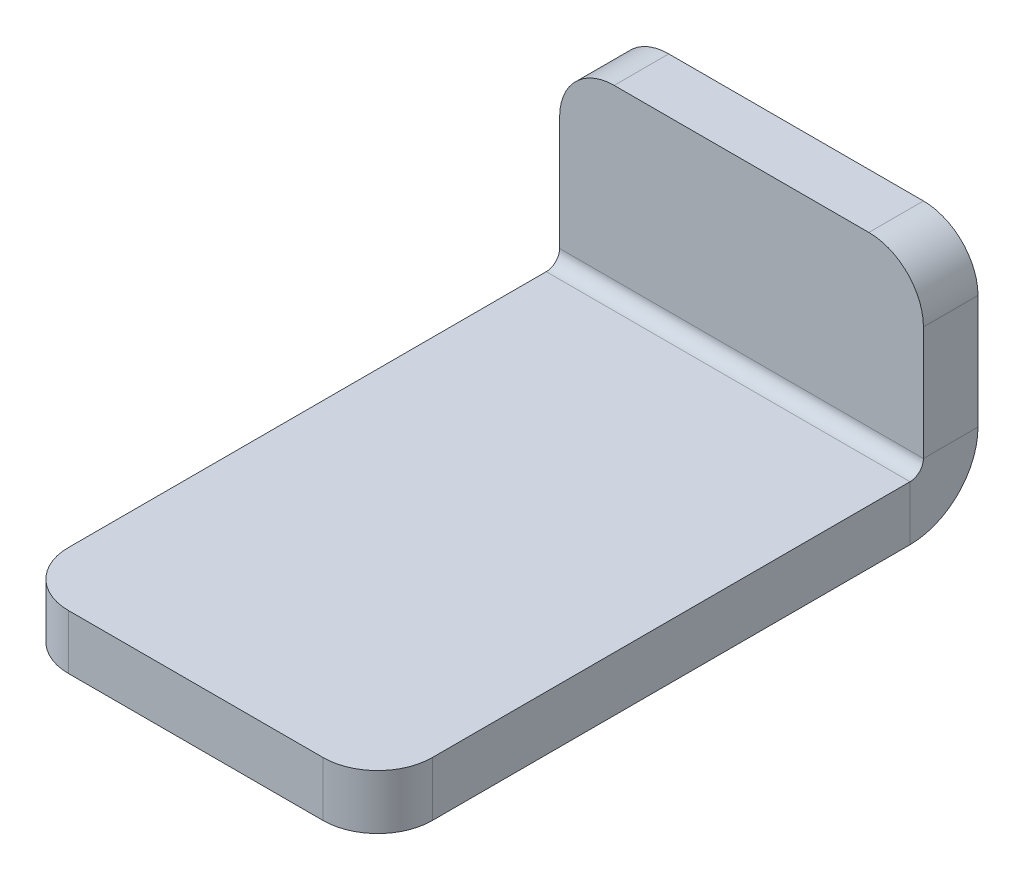
ISO-10303-21;
HEADER;
FILE_DESCRIPTION(('STEP AP214'),'2;1');
FILE_NAME('part.step','',(''),(''),'','','');
FILE_SCHEMA(('AUTOMOTIVE_DESIGN { 1 0 10303 214 1 1 1 1 }'));
ENDSEC;
DATA;
#1=APPLICATION_CONTEXT('core data for automotive mechanical design processes');
#2=APPLICATION_PROTOCOL_DEFINITION('international standard','automotive_design',2000,#1);
#3=PRODUCT_CONTEXT('',#1,'mechanical');
#4=PRODUCT('Part','Part','',(#3));
#5=PRODUCT_RELATED_PRODUCT_CATEGORY('part','',(#4));
#6=PRODUCT_DEFINITION_FORMATION('','',#4);
#7=PRODUCT_DEFINITION_CONTEXT('part definition',#1,'design');
#8=PRODUCT_DEFINITION('design','',#6,#7);
#9=PRODUCT_DEFINITION_SHAPE('','',#8);
#10=(LENGTH_UNIT() NAMED_UNIT(*) SI_UNIT(.MILLI.,.METRE.));
#11=(NAMED_UNIT(*) PLANE_ANGLE_UNIT() SI_UNIT($,.RADIAN.));
#12=(NAMED_UNIT(*) SI_UNIT($,.STERADIAN.) SOLID_ANGLE_UNIT());
#13=UNCERTAINTY_MEASURE_WITH_UNIT(LENGTH_MEASURE(1.E-05),#10,'distance_accuracy_value','');
#14=(GEOMETRIC_REPRESENTATION_CONTEXT(3) GLOBAL_UNCERTAINTY_ASSIGNED_CONTEXT((#13)) GLOBAL_UNIT_ASSIGNED_CONTEXT((#10,
#11,#12)) REPRESENTATION_CONTEXT('',''));
#15=CARTESIAN_POINT('',(0.,0.,0.));
#16=DIRECTION('',(0.,0.,1.));
#17=DIRECTION('',(1.,0.,0.));
#18=AXIS2_PLACEMENT_3D('',#15,#16,#17);
#19=CARTESIAN_POINT('',(20.,0.7366,-30.));
#20=DIRECTION('',(1.,0.,0.));
#21=DIRECTION('',(0.,0.,-1.));
#22=AXIS2_PLACEMENT_3D('',#19,#20,#21);
#23=PLANE('',#22);
#24=DIRECTION('',(0.,0.,-1.));
#25=VECTOR('',#24,1.);
#26=CARTESIAN_POINT('',(20.,0.7366,-30.));
#27=LINE('',#26,#25);
#28=CARTESIAN_POINT('',(20.,0.7366,-30.));
#29=VERTEX_POINT('',#28);
#30=CARTESIAN_POINT('',(20.,0.7366,-33.));
#31=VERTEX_POINT('',#30);
#32=EDGE_CURVE('E124',#29,#31,#27,.T.);
#33=ORIENTED_EDGE('',*,*,#32,.F.);
#34=CARTESIAN_POINT('',(20.,0.7366,-29.2634));
#35=DIRECTION('',(-1.,0.,0.));
#36=DIRECTION('',(0.,0.,1.));
#37=AXIS2_PLACEMENT_3D('',#34,#35,#36);
#38=CIRCLE('',#37,0.7366);
#39=CARTESIAN_POINT('',(20.,0.,-29.2634));
#40=VERTEX_POINT('',#39);
#41=EDGE_CURVE('E128',#40,#29,#38,.F.);
#42=ORIENTED_EDGE('',*,*,#41,.F.);
#43=DIRECTION('',(0.,1.,0.));
#44=VECTOR('',#43,1.);
#45=CARTESIAN_POINT('',(20.,-3.,-29.2634));
#46=LINE('',#45,#44);
#47=CARTESIAN_POINT('',(20.,-3.,-29.2634));
#48=VERTEX_POINT('',#47);
#49=EDGE_CURVE('E136',#48,#40,#46,.T.);
#50=ORIENTED_EDGE('',*,*,#49,.F.);
#51=CARTESIAN_POINT('',(20.,0.7366,-29.2634));
#52=DIRECTION('',(1.,0.,0.));
#53=DIRECTION('',(0.,0.,-1.));
#54=AXIS2_PLACEMENT_3D('',#51,#52,#53);
#55=CIRCLE('',#54,3.7366);
#56=EDGE_CURVE('E130',#48,#31,#55,.T.);
#57=ORIENTED_EDGE('',*,*,#56,.T.);
#58=EDGE_LOOP('',(#33,#42,#50,#57));
#59=FACE_BOUND('',#58,.T.);
#60=ADVANCED_FACE('F34',(#59),#23,.T.);
#61=CARTESIAN_POINT('',(20.,-3.,-29.2634));
#62=DIRECTION('',(1.,0.,0.));
#63=DIRECTION('',(0.,0.,-1.));
#64=AXIS2_PLACEMENT_3D('',#61,#62,#63);
#65=PLANE('',#64);
#66=DIRECTION('',(0.,1.,0.));
#67=VECTOR('',#66,1.);
#68=CARTESIAN_POINT('',(20.,0.,-33.));
#69=LINE('',#68,#67);
#70=CARTESIAN_POINT('',(20.,7.,-33.));
#71=VERTEX_POINT('',#70);
#72=EDGE_CURVE('E157',#31,#71,#69,.T.);
#73=ORIENTED_EDGE('',*,*,#72,.T.);
#74=DIRECTION('',(0.,0.,-1.));
#75=VECTOR('',#74,1.);
#76=CARTESIAN_POINT('',(20.,7.,-29.2634));
#77=LINE('',#76,#75);
#78=CARTESIAN_POINT('',(20.,7.,-30.));
#79=VERTEX_POINT('',#78);
#80=EDGE_CURVE('E11',#71,#79,#77,.F.);
#81=ORIENTED_EDGE('',*,*,#80,.T.);
#82=DIRECTION('',(0.,1.,0.));
#83=VECTOR('',#82,1.);
#84=CARTESIAN_POINT('',(20.,0.,-30.));
#85=LINE('',#84,#83);
#86=EDGE_CURVE('E145',#29,#79,#85,.T.);
#87=ORIENTED_EDGE('',*,*,#86,.F.);
#88=ORIENTED_EDGE('',*,*,#32,.T.);
#89=EDGE_LOOP('',(#73,#81,#87,#88));
#90=FACE_BOUND('',#89,.T.);
#91=ADVANCED_FACE('F155',(#90),#65,.T.);
#92=CARTESIAN_POINT('',(0.,0.,-29.2634));
#93=DIRECTION('',(-1.,0.,0.));
#94=DIRECTION('',(0.,0.,1.));
#95=AXIS2_PLACEMENT_3D('',#92,#93,#94);
#96=PLANE('',#95);
#97=DIRECTION('',(0.,-1.,0.));
#98=VECTOR('',#97,1.);
#99=CARTESIAN_POINT('',(0.,0.,-29.2634));
#100=LINE('',#99,#98);
#101=CARTESIAN_POINT('',(0.,0.,-29.2634));
#102=VERTEX_POINT('',#101);
#103=CARTESIAN_POINT('',(0.,-3.,-29.2634));
#104=VERTEX_POINT('',#103);
#105=EDGE_CURVE('E200',#102,#104,#100,.T.);
#106=ORIENTED_EDGE('',*,*,#105,.F.);
#107=CARTESIAN_POINT('',(0.,0.7366,-29.2634));
#108=DIRECTION('',(-1.,0.,0.));
#109=DIRECTION('',(0.,0.,1.));
#110=AXIS2_PLACEMENT_3D('',#107,#108,#109);
#111=CIRCLE('',#110,0.7366);
#112=CARTESIAN_POINT('',(0.,0.7366,-30.));
#113=VERTEX_POINT('',#112);
#114=EDGE_CURVE('E175',#102,#113,#111,.F.);
#115=ORIENTED_EDGE('',*,*,#114,.T.);
#116=DIRECTION('',(0.,0.,1.));
#117=VECTOR('',#116,1.);
#118=CARTESIAN_POINT('',(0.,0.7366,-33.));
#119=LINE('',#118,#117);
#120=CARTESIAN_POINT('',(0.,0.7366,-33.));
#121=VERTEX_POINT('',#120);
#122=EDGE_CURVE('E198',#121,#113,#119,.T.);
#123=ORIENTED_EDGE('',*,*,#122,.F.);
#124=CARTESIAN_POINT('',(0.,0.7366,-29.2634));
#125=DIRECTION('',(1.,0.,0.));
#126=DIRECTION('',(0.,0.,-1.));
#127=AXIS2_PLACEMENT_3D('',#124,#125,#126);
#128=CIRCLE('',#127,3.7366);
#129=EDGE_CURVE('E181',#104,#121,#128,.T.);
#130=ORIENTED_EDGE('',*,*,#129,.F.);
#131=EDGE_LOOP('',(#106,#115,#123,#130));
#132=FACE_BOUND('',#131,.T.);
#133=ADVANCED_FACE('F276',(#132),#96,.T.);
#134=CARTESIAN_POINT('',(0.,0.7366,-33.));
#135=DIRECTION('',(-1.,0.,0.));
#136=DIRECTION('',(0.,0.,1.));
#137=AXIS2_PLACEMENT_3D('',#134,#135,#136);
#138=PLANE('',#137);
#139=DIRECTION('',(0.,0.,-1.));
#140=VECTOR('',#139,1.);
#141=CARTESIAN_POINT('',(0.,-3.,0.));
#142=LINE('',#141,#140);
#143=CARTESIAN_POINT('',(0.,-3.,-3.));
#144=VERTEX_POINT('',#143);
#145=EDGE_CURVE('E179',#144,#104,#142,.T.);
#146=ORIENTED_EDGE('',*,*,#145,.F.);
#147=DIRECTION('',(0.,1.,0.));
#148=VECTOR('',#147,1.);
#149=CARTESIAN_POINT('',(0.,0.7366,-3.));
#150=LINE('',#149,#148);
#151=CARTESIAN_POINT('',(0.,0.,-3.));
#152=VERTEX_POINT('',#151);
#153=EDGE_CURVE('E220',#144,#152,#150,.T.);
#154=ORIENTED_EDGE('',*,*,#153,.T.);
#155=DIRECTION('',(0.,0.,-1.));
#156=VECTOR('',#155,1.);
#157=CARTESIAN_POINT('',(0.,0.,0.));
#158=LINE('',#157,#156);
#159=EDGE_CURVE('E177',#152,#102,#158,.T.);
#160=ORIENTED_EDGE('',*,*,#159,.T.);
#161=ORIENTED_EDGE('',*,*,#105,.T.);
#162=EDGE_LOOP('',(#146,#154,#160,#161));
#163=FACE_BOUND('',#162,.T.);
#164=ADVANCED_FACE('F242',(#163),#138,.T.);
#165=CARTESIAN_POINT('',(20.,0.,-33.));
#166=DIRECTION('',(0.,0.,1.));
#167=DIRECTION('',(1.,0.,0.));
#168=AXIS2_PLACEMENT_3D('',#165,#166,#167);
#169=PLANE('',#168);
#170=DIRECTION('',(0.,1.,0.));
#171=VECTOR('',#170,1.);
#172=CARTESIAN_POINT('',(0.,0.,-33.));
#173=LINE('',#172,#171);
#174=CARTESIAN_POINT('',(0.,7.,-33.));
#175=VERTEX_POINT('',#174);
#176=EDGE_CURVE('E171',#121,#175,#173,.T.);
#177=ORIENTED_EDGE('',*,*,#176,.T.);
#178=CARTESIAN_POINT('',(3.,7.,-33.));
#179=DIRECTION('',(0.,0.,1.));
#180=DIRECTION('',(1.,0.,0.));
#181=AXIS2_PLACEMENT_3D('',#178,#179,#180);
#182=CIRCLE('',#181,3.);
#183=CARTESIAN_POINT('',(3.,10.,-33.));
#184=VERTEX_POINT('',#183);
#185=EDGE_CURVE('E209',#175,#184,#182,.F.);
#186=ORIENTED_EDGE('',*,*,#185,.T.);
#187=DIRECTION('',(-1.,0.,0.));
#188=VECTOR('',#187,1.);
#189=CARTESIAN_POINT('',(20.,10.,-33.));
#190=LINE('',#189,#188);
#191=CARTESIAN_POINT('',(17.,10.,-33.));
#192=VERTEX_POINT('',#191);
#193=EDGE_CURVE('E195',#192,#184,#190,.T.);
#194=ORIENTED_EDGE('',*,*,#193,.F.);
#195=CARTESIAN_POINT('',(17.,7.,-33.));
#196=DIRECTION('',(0.,0.,1.));
#197=DIRECTION('',(1.,0.,0.));
#198=AXIS2_PLACEMENT_3D('',#195,#196,#197);
#199=CIRCLE('',#198,3.);
#200=EDGE_CURVE('E207',#192,#71,#199,.F.);
#201=ORIENTED_EDGE('',*,*,#200,.T.);
#202=ORIENTED_EDGE('',*,*,#72,.F.);
#203=DIRECTION('',(-1.,0.,0.));
#204=VECTOR('',#203,1.);
#205=CARTESIAN_POINT('',(20.,0.7366,-33.));
#206=LINE('',#205,#204);
#207=EDGE_CURVE('E170',#31,#121,#206,.T.);
#208=ORIENTED_EDGE('',*,*,#207,.T.);
#209=EDGE_LOOP('',(#177,#186,#194,#201,#202,#208));
#210=FACE_BOUND('',#209,.T.);
#211=ADVANCED_FACE('F261',(#210),#169,.F.);
#212=CARTESIAN_POINT('',(20.,10.,-30.));
#213=DIRECTION('',(0.,1.,0.));
#214=DIRECTION('',(0.,0.,1.));
#215=AXIS2_PLACEMENT_3D('',#212,#213,#214);
#216=PLANE('',#215);
#217=ORIENTED_EDGE('',*,*,#193,.T.);
#218=DIRECTION('',(0.,0.,-1.));
#219=VECTOR('',#218,1.);
#220=CARTESIAN_POINT('',(3.,10.,-30.));
#221=LINE('',#220,#219);
#222=CARTESIAN_POINT('',(3.,10.,-30.));
#223=VERTEX_POINT('',#222);
#224=EDGE_CURVE('E214',#184,#223,#221,.F.);
#225=ORIENTED_EDGE('',*,*,#224,.T.);
#226=DIRECTION('',(-1.,0.,0.));
#227=VECTOR('',#226,1.);
#228=CARTESIAN_POINT('',(20.,10.,-30.));
#229=LINE('',#228,#227);
#230=CARTESIAN_POINT('',(17.,10.,-30.));
#231=VERTEX_POINT('',#230);
#232=EDGE_CURVE('E152',#231,#223,#229,.T.);
#233=ORIENTED_EDGE('',*,*,#232,.F.);
#234=DIRECTION('',(0.,0.,-1.));
#235=VECTOR('',#234,1.);
#236=CARTESIAN_POINT('',(17.,10.,-30.));
#237=LINE('',#236,#235);
#238=EDGE_CURVE('E211',#231,#192,#237,.T.);
#239=ORIENTED_EDGE('',*,*,#238,.T.);
#240=EDGE_LOOP('',(#217,#225,#233,#239));
#241=FACE_BOUND('',#240,.T.);
#242=ADVANCED_FACE('F268',(#241),#216,.T.);
#243=CARTESIAN_POINT('',(20.,0.,-30.));
#244=DIRECTION('',(0.,0.,1.));
#245=DIRECTION('',(1.,0.,0.));
#246=AXIS2_PLACEMENT_3D('',#243,#244,#245);
#247=PLANE('',#246);
#248=ORIENTED_EDGE('',*,*,#232,.T.);
#249=CARTESIAN_POINT('',(3.,7.,-30.));
#250=DIRECTION('',(0.,0.,1.));
#251=DIRECTION('',(1.,0.,0.));
#252=AXIS2_PLACEMENT_3D('',#249,#250,#251);
#253=CIRCLE('',#252,3.);
#254=CARTESIAN_POINT('',(0.,7.,-30.));
#255=VERTEX_POINT('',#254);
#256=EDGE_CURVE('E218',#223,#255,#253,.T.);
#257=ORIENTED_EDGE('',*,*,#256,.T.);
#258=DIRECTION('',(0.,1.,0.));
#259=VECTOR('',#258,1.);
#260=CARTESIAN_POINT('',(0.,0.,-30.));
#261=LINE('',#260,#259);
#262=EDGE_CURVE('E148',#113,#255,#261,.T.);
#263=ORIENTED_EDGE('',*,*,#262,.F.);
#264=DIRECTION('',(-1.,0.,0.));
#265=VECTOR('',#264,1.);
#266=CARTESIAN_POINT('',(20.,0.7366,-30.));
#267=LINE('',#266,#265);
#268=EDGE_CURVE('E142',#29,#113,#267,.T.);
#269=ORIENTED_EDGE('',*,*,#268,.F.);
#270=ORIENTED_EDGE('',*,*,#86,.T.);
#271=CARTESIAN_POINT('',(17.,7.,-30.));
#272=DIRECTION('',(0.,0.,1.));
#273=DIRECTION('',(1.,0.,0.));
#274=AXIS2_PLACEMENT_3D('',#271,#272,#273);
#275=CIRCLE('',#274,3.);
#276=EDGE_CURVE('E216',#79,#231,#275,.T.);
#277=ORIENTED_EDGE('',*,*,#276,.T.);
#278=EDGE_LOOP('',(#248,#257,#263,#269,#270,#277));
#279=FACE_BOUND('',#278,.T.);
#280=ADVANCED_FACE('F144',(#279),#247,.T.);
#281=CARTESIAN_POINT('',(20.,0.7366,-29.2634));
#282=DIRECTION('',(-1.,0.,0.));
#283=DIRECTION('',(0.,0.,1.));
#284=AXIS2_PLACEMENT_3D('',#281,#282,#283);
#285=CYLINDRICAL_SURFACE('',#284,0.7366);
#286=ORIENTED_EDGE('',*,*,#114,.F.);
#287=DIRECTION('',(-1.,0.,0.));
#288=VECTOR('',#287,1.);
#289=CARTESIAN_POINT('',(20.,0.,-29.2634));
#290=LINE('',#289,#288);
#291=EDGE_CURVE('E153',#40,#102,#290,.T.);
#292=ORIENTED_EDGE('',*,*,#291,.F.);
#293=ORIENTED_EDGE('',*,*,#41,.T.);
#294=ORIENTED_EDGE('',*,*,#268,.T.);
#295=EDGE_LOOP('',(#286,#292,#293,#294));
#296=FACE_BOUND('',#295,.T.);
#297=ADVANCED_FACE('F160',(#296),#285,.F.);
#298=CARTESIAN_POINT('',(20.,0.,0.));
#299=DIRECTION('',(0.,1.,0.));
#300=DIRECTION('',(0.,0.,1.));
#301=AXIS2_PLACEMENT_3D('',#298,#299,#300);
#302=PLANE('',#301);
#303=ORIENTED_EDGE('',*,*,#159,.F.);
#304=CARTESIAN_POINT('',(3.,0.,-3.));
#305=DIRECTION('',(0.,1.,0.));
#306=DIRECTION('',(0.,0.,1.));
#307=AXIS2_PLACEMENT_3D('',#304,#305,#306);
#308=CIRCLE('',#307,3.);
#309=CARTESIAN_POINT('',(3.,0.,0.));
#310=VERTEX_POINT('',#309);
#311=EDGE_CURVE('E225',#152,#310,#308,.T.);
#312=ORIENTED_EDGE('',*,*,#311,.T.);
#313=DIRECTION('',(-1.,0.,0.));
#314=VECTOR('',#313,1.);
#315=CARTESIAN_POINT('',(20.,0.,0.));
#316=LINE('',#315,#314);
#317=CARTESIAN_POINT('',(17.,0.,0.));
#318=VERTEX_POINT('',#317);
#319=EDGE_CURVE('E191',#318,#310,#316,.T.);
#320=ORIENTED_EDGE('',*,*,#319,.F.);
#321=CARTESIAN_POINT('',(17.,0.,-3.));
#322=DIRECTION('',(0.,1.,0.));
#323=DIRECTION('',(0.,0.,1.));
#324=AXIS2_PLACEMENT_3D('',#321,#322,#323);
#325=CIRCLE('',#324,3.);
#326=CARTESIAN_POINT('',(20.,0.,-3.));
#327=VERTEX_POINT('',#326);
#328=EDGE_CURVE('E223',#318,#327,#325,.T.);
#329=ORIENTED_EDGE('',*,*,#328,.T.);
#330=DIRECTION('',(0.,0.,-1.));
#331=VECTOR('',#330,1.);
#332=CARTESIAN_POINT('',(20.,0.,0.));
#333=LINE('',#332,#331);
#334=EDGE_CURVE('E162',#327,#40,#333,.T.);
#335=ORIENTED_EDGE('',*,*,#334,.T.);
#336=ORIENTED_EDGE('',*,*,#291,.T.);
#337=EDGE_LOOP('',(#303,#312,#320,#329,#335,#336));
#338=FACE_BOUND('',#337,.T.);
#339=ADVANCED_FACE('F248',(#338),#302,.T.);
#340=CARTESIAN_POINT('',(20.,-3.,0.));
#341=DIRECTION('',(0.,0.,1.));
#342=DIRECTION('',(1.,0.,0.));
#343=AXIS2_PLACEMENT_3D('',#340,#341,#342);
#344=PLANE('',#343);
#345=ORIENTED_EDGE('',*,*,#319,.T.);
#346=DIRECTION('',(0.,1.,0.));
#347=VECTOR('',#346,1.);
#348=CARTESIAN_POINT('',(3.,-3.,0.));
#349=LINE('',#348,#347);
#350=CARTESIAN_POINT('',(3.,-3.,0.));
#351=VERTEX_POINT('',#350);
#352=EDGE_CURVE('E56',#310,#351,#349,.F.);
#353=ORIENTED_EDGE('',*,*,#352,.T.);
#354=DIRECTION('',(-1.,0.,0.));
#355=VECTOR('',#354,1.);
#356=CARTESIAN_POINT('',(20.,-3.,0.));
#357=LINE('',#356,#355);
#358=CARTESIAN_POINT('',(17.,-3.,0.));
#359=VERTEX_POINT('',#358);
#360=EDGE_CURVE('E189',#359,#351,#357,.T.);
#361=ORIENTED_EDGE('',*,*,#360,.F.);
#362=DIRECTION('',(0.,1.,0.));
#363=VECTOR('',#362,1.);
#364=CARTESIAN_POINT('',(17.,0.,0.));
#365=LINE('',#364,#363);
#366=EDGE_CURVE('E227',#359,#318,#365,.T.);
#367=ORIENTED_EDGE('',*,*,#366,.T.);
#368=EDGE_LOOP('',(#345,#353,#361,#367));
#369=FACE_BOUND('',#368,.T.);
#370=ADVANCED_FACE('F249',(#369),#344,.T.);
#371=CARTESIAN_POINT('',(20.,-3.,0.));
#372=DIRECTION('',(0.,1.,0.));
#373=DIRECTION('',(0.,0.,1.));
#374=AXIS2_PLACEMENT_3D('',#371,#372,#373);
#375=PLANE('',#374);
#376=ORIENTED_EDGE('',*,*,#360,.T.);
#377=CARTESIAN_POINT('',(3.,-3.,-3.));
#378=DIRECTION('',(0.,1.,0.));
#379=DIRECTION('',(0.,0.,1.));
#380=AXIS2_PLACEMENT_3D('',#377,#378,#379);
#381=CIRCLE('',#380,3.);
#382=EDGE_CURVE('E233',#351,#144,#381,.F.);
#383=ORIENTED_EDGE('',*,*,#382,.T.);
#384=ORIENTED_EDGE('',*,*,#145,.T.);
#385=DIRECTION('',(-1.,0.,0.));
#386=VECTOR('',#385,1.);
#387=CARTESIAN_POINT('',(20.,-3.,-29.2634));
#388=LINE('',#387,#386);
#389=EDGE_CURVE('E186',#48,#104,#388,.T.);
#390=ORIENTED_EDGE('',*,*,#389,.F.);
#391=DIRECTION('',(0.,0.,-1.));
#392=VECTOR('',#391,1.);
#393=CARTESIAN_POINT('',(20.,-3.,0.));
#394=LINE('',#393,#392);
#395=CARTESIAN_POINT('',(20.,-3.,-3.));
#396=VERTEX_POINT('',#395);
#397=EDGE_CURVE('E164',#396,#48,#394,.T.);
#398=ORIENTED_EDGE('',*,*,#397,.F.);
#399=CARTESIAN_POINT('',(17.,-3.,-3.));
#400=DIRECTION('',(0.,1.,0.));
#401=DIRECTION('',(0.,0.,1.));
#402=AXIS2_PLACEMENT_3D('',#399,#400,#401);
#403=CIRCLE('',#402,3.);
#404=EDGE_CURVE('E231',#396,#359,#403,.F.);
#405=ORIENTED_EDGE('',*,*,#404,.T.);
#406=EDGE_LOOP('',(#376,#383,#384,#390,#398,#405));
#407=FACE_BOUND('',#406,.T.);
#408=ADVANCED_FACE('F237',(#407),#375,.F.);
#409=CARTESIAN_POINT('',(20.,0.7366,-29.2634));
#410=DIRECTION('',(-1.,0.,0.));
#411=DIRECTION('',(0.,0.,1.));
#412=AXIS2_PLACEMENT_3D('',#409,#410,#411);
#413=CYLINDRICAL_SURFACE('',#412,3.7366);
#414=ORIENTED_EDGE('',*,*,#129,.T.);
#415=ORIENTED_EDGE('',*,*,#207,.F.);
#416=ORIENTED_EDGE('',*,*,#56,.F.);
#417=ORIENTED_EDGE('',*,*,#389,.T.);
#418=EDGE_LOOP('',(#414,#415,#416,#417));
#419=FACE_BOUND('',#418,.T.);
#420=ADVANCED_FACE('F257',(#419),#413,.T.);
#421=CARTESIAN_POINT('',(20.,0.7366,-29.2634));
#422=DIRECTION('',(-1.,0.,0.));
#423=DIRECTION('',(0.,0.,1.));
#424=AXIS2_PLACEMENT_3D('',#421,#422,#423);
#425=PLANE('',#424);
#426=ORIENTED_EDGE('',*,*,#334,.F.);
#427=DIRECTION('',(0.,1.,0.));
#428=VECTOR('',#427,1.);
#429=CARTESIAN_POINT('',(20.,-3.,-3.));
#430=LINE('',#429,#428);
#431=EDGE_CURVE('E42',#327,#396,#430,.F.);
#432=ORIENTED_EDGE('',*,*,#431,.T.);
#433=ORIENTED_EDGE('',*,*,#397,.T.);
#434=ORIENTED_EDGE('',*,*,#49,.T.);
#435=EDGE_LOOP('',(#426,#432,#433,#434));
#436=FACE_BOUND('',#435,.T.);
#437=ADVANCED_FACE('F254',(#436),#425,.F.);
#438=CARTESIAN_POINT('',(0.,0.7366,-29.2634));
#439=DIRECTION('',(-1.,0.,0.));
#440=DIRECTION('',(0.,0.,1.));
#441=AXIS2_PLACEMENT_3D('',#438,#439,#440);
#442=PLANE('',#441);
#443=ORIENTED_EDGE('',*,*,#262,.T.);
#444=DIRECTION('',(0.,0.,-1.));
#445=VECTOR('',#444,1.);
#446=CARTESIAN_POINT('',(0.,7.,-29.2634));
#447=LINE('',#446,#445);
#448=EDGE_CURVE('E135',#255,#175,#447,.T.);
#449=ORIENTED_EDGE('',*,*,#448,.T.);
#450=ORIENTED_EDGE('',*,*,#176,.F.);
#451=ORIENTED_EDGE('',*,*,#122,.T.);
#452=EDGE_LOOP('',(#443,#449,#450,#451));
#453=FACE_BOUND('',#452,.T.);
#454=ADVANCED_FACE('F274',(#453),#442,.T.);
#455=CARTESIAN_POINT('',(3.,7.,-29.2634));
#456=DIRECTION('',(0.,0.,-1.));
#457=DIRECTION('',(-1.,0.,0.));
#458=AXIS2_PLACEMENT_3D('',#455,#456,#457);
#459=CYLINDRICAL_SURFACE('',#458,3.);
#460=ORIENTED_EDGE('',*,*,#256,.F.);
#461=ORIENTED_EDGE('',*,*,#224,.F.);
#462=ORIENTED_EDGE('',*,*,#185,.F.);
#463=ORIENTED_EDGE('',*,*,#448,.F.);
#464=EDGE_LOOP('',(#460,#461,#462,#463));
#465=FACE_BOUND('',#464,.T.);
#466=ADVANCED_FACE('F271',(#465),#459,.T.);
#467=CARTESIAN_POINT('',(3.,0.7366,-3.));
#468=DIRECTION('',(0.,1.,0.));
#469=DIRECTION('',(0.,0.,1.));
#470=AXIS2_PLACEMENT_3D('',#467,#468,#469);
#471=CYLINDRICAL_SURFACE('',#470,3.);
#472=ORIENTED_EDGE('',*,*,#382,.F.);
#473=ORIENTED_EDGE('',*,*,#352,.F.);
#474=ORIENTED_EDGE('',*,*,#311,.F.);
#475=ORIENTED_EDGE('',*,*,#153,.F.);
#476=EDGE_LOOP('',(#472,#473,#474,#475));
#477=FACE_BOUND('',#476,.T.);
#478=ADVANCED_FACE('F245',(#477),#471,.T.);
#479=CARTESIAN_POINT('',(17.,-3.,-3.));
#480=DIRECTION('',(0.,-1.,0.));
#481=DIRECTION('',(0.,0.,-1.));
#482=AXIS2_PLACEMENT_3D('',#479,#480,#481);
#483=CYLINDRICAL_SURFACE('',#482,3.);
#484=ORIENTED_EDGE('',*,*,#404,.F.);
#485=ORIENTED_EDGE('',*,*,#431,.F.);
#486=ORIENTED_EDGE('',*,*,#328,.F.);
#487=ORIENTED_EDGE('',*,*,#366,.F.);
#488=EDGE_LOOP('',(#484,#485,#486,#487));
#489=FACE_BOUND('',#488,.T.);
#490=ADVANCED_FACE('F253',(#489),#483,.T.);
#491=CARTESIAN_POINT('',(17.,7.,-30.));
#492=DIRECTION('',(0.,0.,-1.));
#493=DIRECTION('',(-1.,0.,0.));
#494=AXIS2_PLACEMENT_3D('',#491,#492,#493);
#495=CYLINDRICAL_SURFACE('',#494,3.);
#496=ORIENTED_EDGE('',*,*,#276,.F.);
#497=ORIENTED_EDGE('',*,*,#80,.F.);
#498=ORIENTED_EDGE('',*,*,#200,.F.);
#499=ORIENTED_EDGE('',*,*,#238,.F.);
#500=EDGE_LOOP('',(#496,#497,#498,#499));
#501=FACE_BOUND('',#500,.T.);
#502=ADVANCED_FACE('F36',(#501),#495,.T.);
#503=CLOSED_SHELL('',(#60,#91,#133,#164,#211,#242,#280,#297,#339,#370,#408,#420,#437,#454,#466,
#478,#490,#502));
#504=MANIFOLD_SOLID_BREP('B2',#503);
#505=ADVANCED_BREP_SHAPE_REPRESENTATION('',(#18,#504),#14);
#506=SHAPE_DEFINITION_REPRESENTATION(#9,#505);
ENDSEC;
END-ISO-10303-21;
